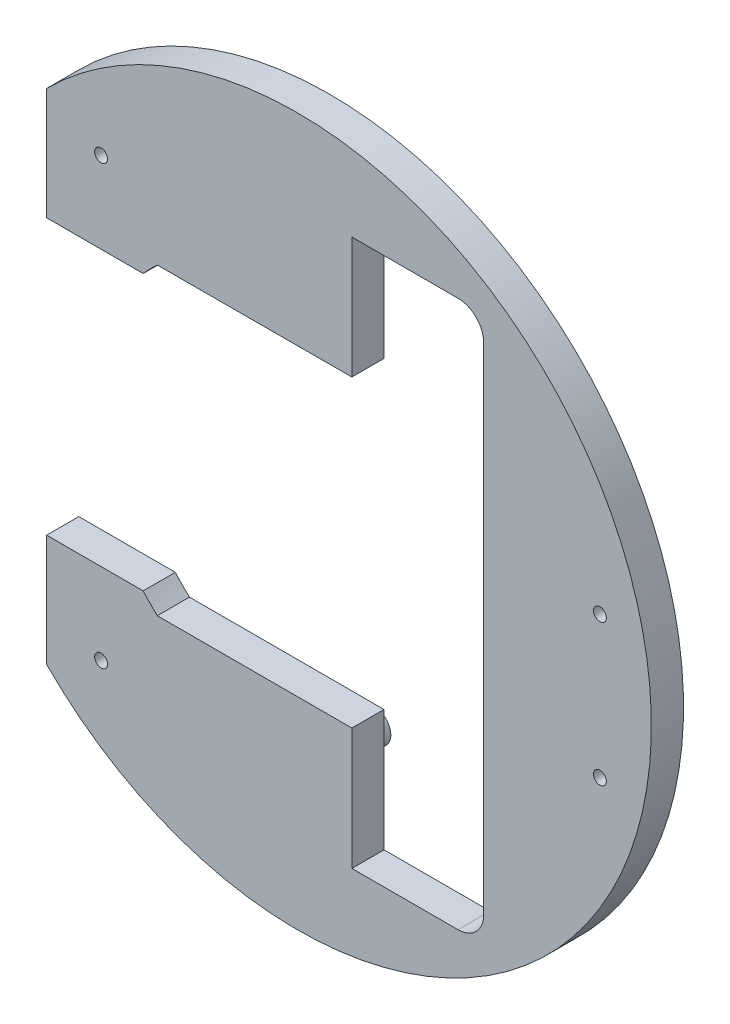
ISO-10303-21;
HEADER;
FILE_DESCRIPTION(('STEP AP214'),'2;1');
FILE_NAME('part.step','',(''),(''),'','','');
FILE_SCHEMA(('AUTOMOTIVE_DESIGN { 1 0 10303 214 1 1 1 1 }'));
ENDSEC;
DATA;
#1=APPLICATION_CONTEXT('core data for automotive mechanical design processes');
#2=APPLICATION_PROTOCOL_DEFINITION('international standard','automotive_design',2000,#1);
#3=PRODUCT_CONTEXT('',#1,'mechanical');
#4=PRODUCT('Part','Part','',(#3));
#5=PRODUCT_RELATED_PRODUCT_CATEGORY('part','',(#4));
#6=PRODUCT_DEFINITION_FORMATION('','',#4);
#7=PRODUCT_DEFINITION_CONTEXT('part definition',#1,'design');
#8=PRODUCT_DEFINITION('design','',#6,#7);
#9=PRODUCT_DEFINITION_SHAPE('','',#8);
#10=(LENGTH_UNIT() NAMED_UNIT(*) SI_UNIT(.MILLI.,.METRE.));
#11=(NAMED_UNIT(*) PLANE_ANGLE_UNIT() SI_UNIT($,.RADIAN.));
#12=(NAMED_UNIT(*) SI_UNIT($,.STERADIAN.) SOLID_ANGLE_UNIT());
#13=UNCERTAINTY_MEASURE_WITH_UNIT(LENGTH_MEASURE(1.E-05),#10,'distance_accuracy_value','');
#14=(GEOMETRIC_REPRESENTATION_CONTEXT(3) GLOBAL_UNCERTAINTY_ASSIGNED_CONTEXT((#13)) GLOBAL_UNIT_ASSIGNED_CONTEXT((#10,
#11,#12)) REPRESENTATION_CONTEXT('',''));
#15=CARTESIAN_POINT('',(0.,0.,0.));
#16=DIRECTION('',(0.,0.,1.));
#17=DIRECTION('',(1.,0.,0.));
#18=AXIS2_PLACEMENT_3D('',#15,#16,#17);
#19=CARTESIAN_POINT('',(-13.047599403235,-23.6022405207636,5.));
#20=DIRECTION('',(0.,-1.,0.));
#21=DIRECTION('',(1.,0.,0.));
#22=AXIS2_PLACEMENT_3D('',#19,#20,#21);
#23=PLANE('',#22);
#24=DIRECTION('',(-1.,0.,0.));
#25=VECTOR('',#24,1.);
#26=CARTESIAN_POINT('',(-13.047599403235,-23.6022405207636,0.));
#27=LINE('',#26,#25);
#28=CARTESIAN_POINT('',(8.4442741610997,-23.6022405207636,0.));
#29=VERTEX_POINT('',#28);
#30=CARTESIAN_POINT('',(-21.7987211184516,-23.6022405207636,0.));
#31=VERTEX_POINT('',#30);
#32=EDGE_CURVE('E109',#29,#31,#27,.T.);
#33=ORIENTED_EDGE('',*,*,#32,.T.);
#34=DIRECTION('',(0.,0.,-1.));
#35=VECTOR('',#34,1.);
#36=CARTESIAN_POINT('',(-21.7987211184516,-23.6022405207636,5.));
#37=LINE('',#36,#35);
#38=CARTESIAN_POINT('',(-21.7987211184516,-23.6022405207636,5.));
#39=VERTEX_POINT('',#38);
#40=EDGE_CURVE('E244',#39,#31,#37,.T.);
#41=ORIENTED_EDGE('',*,*,#40,.F.);
#42=DIRECTION('',(-1.,0.,0.));
#43=VECTOR('',#42,1.);
#44=CARTESIAN_POINT('',(8.4442741610997,-23.6022405207636,5.));
#45=LINE('',#44,#43);
#46=CARTESIAN_POINT('',(8.4442741610997,-23.6022405207636,5.));
#47=VERTEX_POINT('',#46);
#48=EDGE_CURVE('E115',#47,#39,#45,.T.);
#49=ORIENTED_EDGE('',*,*,#48,.F.);
#50=DIRECTION('',(0.,0.,-1.));
#51=VECTOR('',#50,1.);
#52=CARTESIAN_POINT('',(8.4442741610997,-23.6022405207636,5.));
#53=LINE('',#52,#51);
#54=EDGE_CURVE('E173',#47,#29,#53,.T.);
#55=ORIENTED_EDGE('',*,*,#54,.T.);
#56=EDGE_LOOP('',(#33,#41,#49,#55));
#57=FACE_BOUND('',#56,.T.);
#58=ADVANCED_FACE('F33',(#57),#23,.F.);
#59=CARTESIAN_POINT('',(0.,0.,5.));
#60=DIRECTION('',(0.,0.,-1.));
#61=DIRECTION('',(-1.,0.,0.));
#62=AXIS2_PLACEMENT_3D('',#59,#60,#61);
#63=CYLINDRICAL_SURFACE('',#62,32.1286476528347);
#64=CARTESIAN_POINT('',(0.,0.,0.));
#65=DIRECTION('',(0.,0.,-1.));
#66=DIRECTION('',(1.,0.,0.));
#67=AXIS2_PLACEMENT_3D('',#64,#65,#66);
#68=CIRCLE('',#67,32.1286476528347);
#69=CARTESIAN_POINT('',(-24.,-21.3600093632938,0.));
#70=VERTEX_POINT('',#69);
#71=EDGE_CURVE('E178',#31,#70,#68,.T.);
#72=ORIENTED_EDGE('',*,*,#71,.T.);
#73=DIRECTION('',(0.,0.,-1.));
#74=VECTOR('',#73,1.);
#75=CARTESIAN_POINT('',(-24.,-21.3600093632938,5.));
#76=LINE('',#75,#74);
#77=CARTESIAN_POINT('',(-24.,-21.3600093632938,5.));
#78=VERTEX_POINT('',#77);
#79=EDGE_CURVE('E241',#78,#70,#76,.T.);
#80=ORIENTED_EDGE('',*,*,#79,.F.);
#81=CARTESIAN_POINT('',(0.,0.,5.));
#82=DIRECTION('',(0.,0.,-1.));
#83=DIRECTION('',(1.,0.,0.));
#84=AXIS2_PLACEMENT_3D('',#81,#82,#83);
#85=CIRCLE('',#84,32.1286476528347);
#86=EDGE_CURVE('E278',#39,#78,#85,.T.);
#87=ORIENTED_EDGE('',*,*,#86,.F.);
#88=ORIENTED_EDGE('',*,*,#40,.T.);
#89=EDGE_LOOP('',(#72,#80,#87,#88));
#90=FACE_BOUND('',#89,.T.);
#91=ADVANCED_FACE('F269',(#90),#63,.F.);
#92=CARTESIAN_POINT('',(-24.,-21.3600093632938,5.));
#93=DIRECTION('',(0.,-1.,0.));
#94=DIRECTION('',(1.,0.,0.));
#95=AXIS2_PLACEMENT_3D('',#92,#93,#94);
#96=PLANE('',#95);
#97=DIRECTION('',(-1.,0.,0.));
#98=VECTOR('',#97,1.);
#99=CARTESIAN_POINT('',(-24.,-21.3600093632938,0.));
#100=LINE('',#99,#98);
#101=CARTESIAN_POINT('',(-39.,-21.3600093632938,0.));
#102=VERTEX_POINT('',#101);
#103=EDGE_CURVE('E181',#70,#102,#100,.T.);
#104=ORIENTED_EDGE('',*,*,#103,.T.);
#105=DIRECTION('',(0.,0.,-1.));
#106=VECTOR('',#105,1.);
#107=CARTESIAN_POINT('',(-39.,-21.3600093632938,5.));
#108=LINE('',#107,#106);
#109=CARTESIAN_POINT('',(-39.,-21.3600093632938,5.));
#110=VERTEX_POINT('',#109);
#111=EDGE_CURVE('E238',#110,#102,#108,.T.);
#112=ORIENTED_EDGE('',*,*,#111,.F.);
#113=DIRECTION('',(-1.,0.,0.));
#114=VECTOR('',#113,1.);
#115=CARTESIAN_POINT('',(-24.,-21.3600093632938,5.));
#116=LINE('',#115,#114);
#117=EDGE_CURVE('E292',#78,#110,#116,.T.);
#118=ORIENTED_EDGE('',*,*,#117,.F.);
#119=ORIENTED_EDGE('',*,*,#79,.T.);
#120=EDGE_LOOP('',(#104,#112,#118,#119));
#121=FACE_BOUND('',#120,.T.);
#122=ADVANCED_FACE('F274',(#121),#96,.F.);
#123=CARTESIAN_POINT('',(-39.,-21.3600093632938,5.));
#124=DIRECTION('',(1.,0.,0.));
#125=DIRECTION('',(0.,1.,0.));
#126=AXIS2_PLACEMENT_3D('',#123,#124,#125);
#127=PLANE('',#126);
#128=DIRECTION('',(0.,-1.,0.));
#129=VECTOR('',#128,1.);
#130=CARTESIAN_POINT('',(-39.,-21.3600093632938,0.));
#131=LINE('',#130,#129);
#132=CARTESIAN_POINT('',(-39.,-38.7814388593306,0.));
#133=VERTEX_POINT('',#132);
#134=EDGE_CURVE('E183',#102,#133,#131,.T.);
#135=ORIENTED_EDGE('',*,*,#134,.T.);
#136=DIRECTION('',(0.,0.,-1.));
#137=VECTOR('',#136,1.);
#138=CARTESIAN_POINT('',(-39.,-38.7814388593306,5.));
#139=LINE('',#138,#137);
#140=CARTESIAN_POINT('',(-39.,-38.7814388593306,5.));
#141=VERTEX_POINT('',#140);
#142=EDGE_CURVE('E235',#141,#133,#139,.T.);
#143=ORIENTED_EDGE('',*,*,#142,.F.);
#144=DIRECTION('',(0.,-1.,0.));
#145=VECTOR('',#144,1.);
#146=CARTESIAN_POINT('',(-39.,-21.3600093632938,5.));
#147=LINE('',#146,#145);
#148=EDGE_CURVE('E289',#110,#141,#147,.T.);
#149=ORIENTED_EDGE('',*,*,#148,.F.);
#150=ORIENTED_EDGE('',*,*,#111,.T.);
#151=EDGE_LOOP('',(#135,#143,#149,#150));
#152=FACE_BOUND('',#151,.T.);
#153=ADVANCED_FACE('F287',(#152),#127,.F.);
#154=CARTESIAN_POINT('',(0.,0.,5.));
#155=DIRECTION('',(0.,0.,-1.));
#156=DIRECTION('',(-1.,0.,0.));
#157=AXIS2_PLACEMENT_3D('',#154,#155,#156);
#158=CYLINDRICAL_SURFACE('',#157,55.);
#159=CARTESIAN_POINT('',(0.,0.,0.));
#160=DIRECTION('',(0.,0.,1.));
#161=DIRECTION('',(1.,0.,0.));
#162=AXIS2_PLACEMENT_3D('',#159,#160,#161);
#163=CIRCLE('',#162,55.);
#164=CARTESIAN_POINT('',(-39.,38.7814388593306,0.));
#165=VERTEX_POINT('',#164);
#166=EDGE_CURVE('E185',#133,#165,#163,.T.);
#167=ORIENTED_EDGE('',*,*,#166,.T.);
#168=DIRECTION('',(0.,0.,-1.));
#169=VECTOR('',#168,1.);
#170=CARTESIAN_POINT('',(-39.,38.7814388593306,5.));
#171=LINE('',#170,#169);
#172=CARTESIAN_POINT('',(-39.,38.7814388593306,5.));
#173=VERTEX_POINT('',#172);
#174=EDGE_CURVE('E232',#173,#165,#171,.T.);
#175=ORIENTED_EDGE('',*,*,#174,.F.);
#176=CARTESIAN_POINT('',(0.,0.,5.));
#177=DIRECTION('',(0.,0.,1.));
#178=DIRECTION('',(1.,0.,0.));
#179=AXIS2_PLACEMENT_3D('',#176,#177,#178);
#180=CIRCLE('',#179,55.);
#181=EDGE_CURVE('E291',#141,#173,#180,.T.);
#182=ORIENTED_EDGE('',*,*,#181,.F.);
#183=ORIENTED_EDGE('',*,*,#142,.T.);
#184=EDGE_LOOP('',(#167,#175,#182,#183));
#185=FACE_BOUND('',#184,.T.);
#186=ADVANCED_FACE('F552',(#185),#158,.T.);
#187=CARTESIAN_POINT('',(-39.,38.7814388593306,5.));
#188=DIRECTION('',(1.,0.,0.));
#189=DIRECTION('',(0.,1.,0.));
#190=AXIS2_PLACEMENT_3D('',#187,#188,#189);
#191=PLANE('',#190);
#192=DIRECTION('',(0.,-1.,0.));
#193=VECTOR('',#192,1.);
#194=CARTESIAN_POINT('',(-39.,38.7814388593306,0.));
#195=LINE('',#194,#193);
#196=CARTESIAN_POINT('',(-39.,21.3600093632938,0.));
#197=VERTEX_POINT('',#196);
#198=EDGE_CURVE('E187',#165,#197,#195,.T.);
#199=ORIENTED_EDGE('',*,*,#198,.T.);
#200=DIRECTION('',(0.,0.,-1.));
#201=VECTOR('',#200,1.);
#202=CARTESIAN_POINT('',(-39.,21.3600093632938,5.));
#203=LINE('',#202,#201);
#204=CARTESIAN_POINT('',(-39.,21.3600093632938,5.));
#205=VERTEX_POINT('',#204);
#206=EDGE_CURVE('E229',#205,#197,#203,.T.);
#207=ORIENTED_EDGE('',*,*,#206,.F.);
#208=DIRECTION('',(0.,-1.,0.));
#209=VECTOR('',#208,1.);
#210=CARTESIAN_POINT('',(-39.,38.7814388593306,5.));
#211=LINE('',#210,#209);
#212=EDGE_CURVE('E294',#173,#205,#211,.T.);
#213=ORIENTED_EDGE('',*,*,#212,.F.);
#214=ORIENTED_EDGE('',*,*,#174,.T.);
#215=EDGE_LOOP('',(#199,#207,#213,#214));
#216=FACE_BOUND('',#215,.T.);
#217=ADVANCED_FACE('F542',(#216),#191,.F.);
#218=CARTESIAN_POINT('',(-39.,21.3600093632938,5.));
#219=DIRECTION('',(0.,1.,0.));
#220=DIRECTION('',(-1.,0.,0.));
#221=AXIS2_PLACEMENT_3D('',#218,#219,#220);
#222=PLANE('',#221);
#223=DIRECTION('',(1.,0.,0.));
#224=VECTOR('',#223,1.);
#225=CARTESIAN_POINT('',(-39.,21.3600093632938,0.));
#226=LINE('',#225,#224);
#227=CARTESIAN_POINT('',(-24.,21.3600093632938,0.));
#228=VERTEX_POINT('',#227);
#229=EDGE_CURVE('E189',#197,#228,#226,.T.);
#230=ORIENTED_EDGE('',*,*,#229,.T.);
#231=DIRECTION('',(0.,0.,-1.));
#232=VECTOR('',#231,1.);
#233=CARTESIAN_POINT('',(-24.,21.3600093632938,5.));
#234=LINE('',#233,#232);
#235=CARTESIAN_POINT('',(-24.,21.3600093632938,5.));
#236=VERTEX_POINT('',#235);
#237=EDGE_CURVE('E226',#236,#228,#234,.T.);
#238=ORIENTED_EDGE('',*,*,#237,.F.);
#239=DIRECTION('',(1.,0.,0.));
#240=VECTOR('',#239,1.);
#241=CARTESIAN_POINT('',(-39.,21.3600093632938,5.));
#242=LINE('',#241,#240);
#243=EDGE_CURVE('E300',#205,#236,#242,.T.);
#244=ORIENTED_EDGE('',*,*,#243,.F.);
#245=ORIENTED_EDGE('',*,*,#206,.T.);
#246=EDGE_LOOP('',(#230,#238,#244,#245));
#247=FACE_BOUND('',#246,.T.);
#248=ADVANCED_FACE('F532',(#247),#222,.F.);
#249=CARTESIAN_POINT('',(0.,0.,5.));
#250=DIRECTION('',(0.,0.,-1.));
#251=DIRECTION('',(-1.,0.,0.));
#252=AXIS2_PLACEMENT_3D('',#249,#250,#251);
#253=CYLINDRICAL_SURFACE('',#252,32.1286476528347);
#254=CARTESIAN_POINT('',(0.,0.,0.));
#255=DIRECTION('',(0.,0.,-1.));
#256=DIRECTION('',(1.,0.,0.));
#257=AXIS2_PLACEMENT_3D('',#254,#255,#256);
#258=CIRCLE('',#257,32.1286476528347);
#259=CARTESIAN_POINT('',(-21.7987211184532,23.6022405207621,0.));
#260=VERTEX_POINT('',#259);
#261=EDGE_CURVE('E191',#228,#260,#258,.T.);
#262=ORIENTED_EDGE('',*,*,#261,.T.);
#263=DIRECTION('',(0.,0.,-1.));
#264=VECTOR('',#263,1.);
#265=CARTESIAN_POINT('',(-21.7987211184532,23.6022405207621,5.));
#266=LINE('',#265,#264);
#267=CARTESIAN_POINT('',(-21.7987211184532,23.6022405207621,5.));
#268=VERTEX_POINT('',#267);
#269=EDGE_CURVE('E223',#268,#260,#266,.T.);
#270=ORIENTED_EDGE('',*,*,#269,.F.);
#271=CARTESIAN_POINT('',(0.,0.,5.));
#272=DIRECTION('',(0.,0.,-1.));
#273=DIRECTION('',(1.,0.,0.));
#274=AXIS2_PLACEMENT_3D('',#271,#272,#273);
#275=CIRCLE('',#274,32.1286476528347);
#276=EDGE_CURVE('E302',#236,#268,#275,.T.);
#277=ORIENTED_EDGE('',*,*,#276,.F.);
#278=ORIENTED_EDGE('',*,*,#237,.T.);
#279=EDGE_LOOP('',(#262,#270,#277,#278));
#280=FACE_BOUND('',#279,.T.);
#281=ADVANCED_FACE('F522',(#280),#253,.F.);
#282=CARTESIAN_POINT('',(-21.7987211184532,23.6022405207621,5.));
#283=DIRECTION('',(-0.00169296763792218,0.999998566929262,0.));
#284=DIRECTION('',(-0.999998566929262,-0.00169296763792218,0.));
#285=AXIS2_PLACEMENT_3D('',#282,#283,#284);
#286=PLANE('',#285);
#287=DIRECTION('',(0.999998566929262,0.00169296763792218,0.));
#288=VECTOR('',#287,1.);
#289=CARTESIAN_POINT('',(-21.7987211184532,23.6022405207621,0.));
#290=LINE('',#289,#288);
#291=CARTESIAN_POINT('',(8.4442741610997,23.6534410064181,0.));
#292=VERTEX_POINT('',#291);
#293=EDGE_CURVE('E193',#260,#292,#290,.T.);
#294=ORIENTED_EDGE('',*,*,#293,.T.);
#295=DIRECTION('',(0.,0.,-1.));
#296=VECTOR('',#295,1.);
#297=CARTESIAN_POINT('',(8.4442741610997,23.6534410064181,5.));
#298=LINE('',#297,#296);
#299=CARTESIAN_POINT('',(8.4442741610997,23.6534410064181,5.));
#300=VERTEX_POINT('',#299);
#301=EDGE_CURVE('E220',#300,#292,#298,.T.);
#302=ORIENTED_EDGE('',*,*,#301,.F.);
#303=DIRECTION('',(0.999998566929262,0.00169296763792218,0.));
#304=VECTOR('',#303,1.);
#305=CARTESIAN_POINT('',(-21.7987211184532,23.6022405207621,5.));
#306=LINE('',#305,#304);
#307=EDGE_CURVE('E304',#268,#300,#306,.T.);
#308=ORIENTED_EDGE('',*,*,#307,.F.);
#309=ORIENTED_EDGE('',*,*,#269,.T.);
#310=EDGE_LOOP('',(#294,#302,#308,#309));
#311=FACE_BOUND('',#310,.T.);
#312=ADVANCED_FACE('F512',(#311),#286,.F.);
#313=CARTESIAN_POINT('',(8.4442741610997,23.6534410064181,5.));
#314=DIRECTION('',(-1.,0.,0.));
#315=DIRECTION('',(0.,-1.,0.));
#316=AXIS2_PLACEMENT_3D('',#313,#314,#315);
#317=PLANE('',#316);
#318=DIRECTION('',(0.,1.,0.));
#319=VECTOR('',#318,1.);
#320=CARTESIAN_POINT('',(8.4442741610997,23.6534410064181,0.));
#321=LINE('',#320,#319);
#322=CARTESIAN_POINT('',(8.44427416109974,42.5,0.));
#323=VERTEX_POINT('',#322);
#324=EDGE_CURVE('E195',#292,#323,#321,.T.);
#325=ORIENTED_EDGE('',*,*,#324,.T.);
#326=DIRECTION('',(0.,0.,-1.));
#327=VECTOR('',#326,1.);
#328=CARTESIAN_POINT('',(8.44427416109974,42.5,5.));
#329=LINE('',#328,#327);
#330=CARTESIAN_POINT('',(8.44427416109974,42.5,5.));
#331=VERTEX_POINT('',#330);
#332=EDGE_CURVE('E217',#331,#323,#329,.T.);
#333=ORIENTED_EDGE('',*,*,#332,.F.);
#334=DIRECTION('',(0.,1.,0.));
#335=VECTOR('',#334,1.);
#336=CARTESIAN_POINT('',(8.4442741610997,23.6534410064181,5.));
#337=LINE('',#336,#335);
#338=EDGE_CURVE('E306',#300,#331,#337,.T.);
#339=ORIENTED_EDGE('',*,*,#338,.F.);
#340=ORIENTED_EDGE('',*,*,#301,.T.);
#341=EDGE_LOOP('',(#325,#333,#339,#340));
#342=FACE_BOUND('',#341,.T.);
#343=ADVANCED_FACE('F502',(#342),#317,.F.);
#344=CARTESIAN_POINT('',(8.44427416109974,42.5,5.));
#345=DIRECTION('',(0.,1.,0.));
#346=DIRECTION('',(0.,0.,1.));
#347=AXIS2_PLACEMENT_3D('',#344,#345,#346);
#348=PLANE('',#347);
#349=DIRECTION('',(1.,0.,0.));
#350=VECTOR('',#349,1.);
#351=CARTESIAN_POINT('',(8.44427416109974,42.5,0.));
#352=LINE('',#351,#350);
#353=CARTESIAN_POINT('',(24.9440182402168,42.5,0.));
#354=VERTEX_POINT('',#353);
#355=EDGE_CURVE('E197',#323,#354,#352,.T.);
#356=ORIENTED_EDGE('',*,*,#355,.T.);
#357=DIRECTION('',(0.,0.,-1.));
#358=VECTOR('',#357,1.);
#359=CARTESIAN_POINT('',(24.9440182402168,42.5,5.));
#360=LINE('',#359,#358);
#361=CARTESIAN_POINT('',(24.9440182402168,42.5,5.));
#362=VERTEX_POINT('',#361);
#363=EDGE_CURVE('E214',#362,#354,#360,.T.);
#364=ORIENTED_EDGE('',*,*,#363,.F.);
#365=DIRECTION('',(1.,0.,0.));
#366=VECTOR('',#365,1.);
#367=CARTESIAN_POINT('',(8.44427416109974,42.5,5.));
#368=LINE('',#367,#366);
#369=EDGE_CURVE('E308',#331,#362,#368,.T.);
#370=ORIENTED_EDGE('',*,*,#369,.F.);
#371=ORIENTED_EDGE('',*,*,#332,.T.);
#372=EDGE_LOOP('',(#356,#364,#370,#371));
#373=FACE_BOUND('',#372,.T.);
#374=ADVANCED_FACE('F493',(#373),#348,.F.);
#375=CARTESIAN_POINT('',(24.9440182402168,38.5,5.));
#376=DIRECTION('',(0.,0.,-1.));
#377=DIRECTION('',(-1.,0.,0.));
#378=AXIS2_PLACEMENT_3D('',#375,#376,#377);
#379=CYLINDRICAL_SURFACE('',#378,4.);
#380=CARTESIAN_POINT('',(24.9440182402168,38.5,0.));
#381=DIRECTION('',(0.,0.,-1.));
#382=DIRECTION('',(1.,0.,0.));
#383=AXIS2_PLACEMENT_3D('',#380,#381,#382);
#384=CIRCLE('',#383,4.);
#385=CARTESIAN_POINT('',(28.9440182402168,38.5,0.));
#386=VERTEX_POINT('',#385);
#387=EDGE_CURVE('E199',#354,#386,#384,.T.);
#388=ORIENTED_EDGE('',*,*,#387,.T.);
#389=DIRECTION('',(0.,0.,-1.));
#390=VECTOR('',#389,1.);
#391=CARTESIAN_POINT('',(28.9440182402168,38.5,5.));
#392=LINE('',#391,#390);
#393=CARTESIAN_POINT('',(28.9440182402168,38.5,5.));
#394=VERTEX_POINT('',#393);
#395=EDGE_CURVE('E211',#394,#386,#392,.T.);
#396=ORIENTED_EDGE('',*,*,#395,.F.);
#397=CARTESIAN_POINT('',(24.9440182402168,38.5,5.));
#398=DIRECTION('',(0.,0.,-1.));
#399=DIRECTION('',(1.,0.,0.));
#400=AXIS2_PLACEMENT_3D('',#397,#398,#399);
#401=CIRCLE('',#400,4.);
#402=EDGE_CURVE('E310',#362,#394,#401,.T.);
#403=ORIENTED_EDGE('',*,*,#402,.F.);
#404=ORIENTED_EDGE('',*,*,#363,.T.);
#405=EDGE_LOOP('',(#388,#396,#403,#404));
#406=FACE_BOUND('',#405,.T.);
#407=ADVANCED_FACE('F316',(#406),#379,.F.);
#408=CARTESIAN_POINT('',(28.9440182402168,38.5,5.));
#409=DIRECTION('',(1.,0.,0.));
#410=DIRECTION('',(0.,0.,-1.));
#411=AXIS2_PLACEMENT_3D('',#408,#409,#410);
#412=PLANE('',#411);
#413=DIRECTION('',(0.,-1.,0.));
#414=VECTOR('',#413,1.);
#415=CARTESIAN_POINT('',(28.9440182402168,38.5,0.));
#416=LINE('',#415,#414);
#417=CARTESIAN_POINT('',(28.9440182402168,-38.5,0.));
#418=VERTEX_POINT('',#417);
#419=EDGE_CURVE('E201',#386,#418,#416,.T.);
#420=ORIENTED_EDGE('',*,*,#419,.T.);
#421=DIRECTION('',(0.,0.,-1.));
#422=VECTOR('',#421,1.);
#423=CARTESIAN_POINT('',(28.9440182402168,-38.5,5.));
#424=LINE('',#423,#422);
#425=CARTESIAN_POINT('',(28.9440182402168,-38.5,5.));
#426=VERTEX_POINT('',#425);
#427=EDGE_CURVE('E168',#426,#418,#424,.T.);
#428=ORIENTED_EDGE('',*,*,#427,.F.);
#429=DIRECTION('',(0.,-1.,0.));
#430=VECTOR('',#429,1.);
#431=CARTESIAN_POINT('',(28.9440182402168,38.5,5.));
#432=LINE('',#431,#430);
#433=EDGE_CURVE('E159',#394,#426,#432,.T.);
#434=ORIENTED_EDGE('',*,*,#433,.F.);
#435=ORIENTED_EDGE('',*,*,#395,.T.);
#436=EDGE_LOOP('',(#420,#428,#434,#435));
#437=FACE_BOUND('',#436,.T.);
#438=ADVANCED_FACE('F320',(#437),#412,.F.);
#439=CARTESIAN_POINT('',(24.9440182402168,-38.5,5.));
#440=DIRECTION('',(0.,0.,-1.));
#441=DIRECTION('',(-1.,0.,0.));
#442=AXIS2_PLACEMENT_3D('',#439,#440,#441);
#443=CYLINDRICAL_SURFACE('',#442,4.);
#444=CARTESIAN_POINT('',(24.9440182402168,-38.5,0.));
#445=DIRECTION('',(0.,0.,-1.));
#446=DIRECTION('',(1.,0.,0.));
#447=AXIS2_PLACEMENT_3D('',#444,#445,#446);
#448=CIRCLE('',#447,4.);
#449=CARTESIAN_POINT('',(24.9440182402168,-42.5,0.));
#450=VERTEX_POINT('',#449);
#451=EDGE_CURVE('E167',#418,#450,#448,.T.);
#452=ORIENTED_EDGE('',*,*,#451,.T.);
#453=DIRECTION('',(0.,0.,-1.));
#454=VECTOR('',#453,1.);
#455=CARTESIAN_POINT('',(24.9440182402168,-42.5,5.));
#456=LINE('',#455,#454);
#457=CARTESIAN_POINT('',(24.9440182402168,-42.5,5.));
#458=VERTEX_POINT('',#457);
#459=EDGE_CURVE('E164',#458,#450,#456,.T.);
#460=ORIENTED_EDGE('',*,*,#459,.F.);
#461=CARTESIAN_POINT('',(24.9440182402168,-38.5,5.));
#462=DIRECTION('',(0.,0.,-1.));
#463=DIRECTION('',(1.,0.,0.));
#464=AXIS2_PLACEMENT_3D('',#461,#462,#463);
#465=CIRCLE('',#464,4.);
#466=EDGE_CURVE('E153',#426,#458,#465,.T.);
#467=ORIENTED_EDGE('',*,*,#466,.F.);
#468=ORIENTED_EDGE('',*,*,#427,.T.);
#469=EDGE_LOOP('',(#452,#460,#467,#468));
#470=FACE_BOUND('',#469,.T.);
#471=ADVANCED_FACE('F165',(#470),#443,.F.);
#472=CARTESIAN_POINT('',(24.9440182402168,-42.5,5.));
#473=DIRECTION('',(0.,-1.,0.));
#474=DIRECTION('',(0.,0.,-1.));
#475=AXIS2_PLACEMENT_3D('',#472,#473,#474);
#476=PLANE('',#475);
#477=DIRECTION('',(-1.,0.,0.));
#478=VECTOR('',#477,1.);
#479=CARTESIAN_POINT('',(24.9440182402168,-42.5,0.));
#480=LINE('',#479,#478);
#481=CARTESIAN_POINT('',(8.4442741610997,-42.5,0.));
#482=VERTEX_POINT('',#481);
#483=EDGE_CURVE('E102',#450,#482,#480,.T.);
#484=ORIENTED_EDGE('',*,*,#483,.T.);
#485=DIRECTION('',(0.,0.,-1.));
#486=VECTOR('',#485,1.);
#487=CARTESIAN_POINT('',(8.4442741610997,-42.5,5.));
#488=LINE('',#487,#486);
#489=CARTESIAN_POINT('',(8.4442741610997,-42.5,5.));
#490=VERTEX_POINT('',#489);
#491=EDGE_CURVE('E169',#490,#482,#488,.T.);
#492=ORIENTED_EDGE('',*,*,#491,.F.);
#493=DIRECTION('',(-1.,0.,0.));
#494=VECTOR('',#493,1.);
#495=CARTESIAN_POINT('',(24.9440182402168,-42.5,5.));
#496=LINE('',#495,#494);
#497=EDGE_CURVE('E157',#458,#490,#496,.T.);
#498=ORIENTED_EDGE('',*,*,#497,.F.);
#499=ORIENTED_EDGE('',*,*,#459,.T.);
#500=EDGE_LOOP('',(#484,#492,#498,#499));
#501=FACE_BOUND('',#500,.T.);
#502=ADVANCED_FACE('F171',(#501),#476,.F.);
#503=CARTESIAN_POINT('',(8.4442741610997,-42.5,5.));
#504=DIRECTION('',(-1.,0.,0.));
#505=DIRECTION('',(0.,0.,1.));
#506=AXIS2_PLACEMENT_3D('',#503,#504,#505);
#507=PLANE('',#506);
#508=DIRECTION('',(0.,1.,0.));
#509=VECTOR('',#508,1.);
#510=CARTESIAN_POINT('',(8.4442741610997,-42.5,0.));
#511=LINE('',#510,#509);
#512=EDGE_CURVE('E205',#482,#29,#511,.T.);
#513=ORIENTED_EDGE('',*,*,#512,.T.);
#514=ORIENTED_EDGE('',*,*,#54,.F.);
#515=DIRECTION('',(0.,1.,0.));
#516=VECTOR('',#515,1.);
#517=CARTESIAN_POINT('',(8.4442741610997,-42.5,5.));
#518=LINE('',#517,#516);
#519=EDGE_CURVE('E49',#490,#47,#518,.T.);
#520=ORIENTED_EDGE('',*,*,#519,.F.);
#521=ORIENTED_EDGE('',*,*,#491,.T.);
#522=EDGE_LOOP('',(#513,#514,#520,#521));
#523=FACE_BOUND('',#522,.T.);
#524=ADVANCED_FACE('F262',(#523),#507,.F.);
#525=CARTESIAN_POINT('',(0.,0.,5.));
#526=DIRECTION('',(0.,0.,1.));
#527=DIRECTION('',(1.,0.,0.));
#528=AXIS2_PLACEMENT_3D('',#525,#526,#527);
#529=PLANE('',#528);
#530=CARTESIAN_POINT('',(-30.5378788909605,-34.,5.));
#531=DIRECTION('',(0.,0.,1.));
#532=DIRECTION('',(1.,0.,0.));
#533=AXIS2_PLACEMENT_3D('',#530,#531,#532);
#534=CIRCLE('',#533,1.);
#535=CARTESIAN_POINT('',(-29.5378788909605,-34.,5.));
#536=VERTEX_POINT('',#535);
#537=EDGE_CURVE('E346',#536,#536,#534,.T.);
#538=ORIENTED_EDGE('',*,*,#537,.F.);
#539=EDGE_LOOP('',(#538));
#540=FACE_BOUND('',#539,.T.);
#541=CARTESIAN_POINT('',(-30.5378788909605,34.,5.));
#542=DIRECTION('',(0.,0.,1.));
#543=DIRECTION('',(1.,0.,0.));
#544=AXIS2_PLACEMENT_3D('',#541,#542,#543);
#545=CIRCLE('',#544,1.);
#546=CARTESIAN_POINT('',(-29.5378788909605,34.,5.));
#547=VERTEX_POINT('',#546);
#548=EDGE_CURVE('E340',#547,#547,#545,.T.);
#549=ORIENTED_EDGE('',*,*,#548,.F.);
#550=EDGE_LOOP('',(#549));
#551=FACE_BOUND('',#550,.T.);
#552=CARTESIAN_POINT('',(47.,11.,5.));
#553=DIRECTION('',(0.,0.,1.));
#554=DIRECTION('',(1.,0.,0.));
#555=AXIS2_PLACEMENT_3D('',#552,#553,#554);
#556=CIRCLE('',#555,0.999999999999998);
#557=CARTESIAN_POINT('',(48.,11.,5.));
#558=VERTEX_POINT('',#557);
#559=EDGE_CURVE('E333',#558,#558,#556,.T.);
#560=ORIENTED_EDGE('',*,*,#559,.F.);
#561=EDGE_LOOP('',(#560));
#562=FACE_BOUND('',#561,.T.);
#563=CARTESIAN_POINT('',(47.,-11.,5.));
#564=DIRECTION('',(0.,0.,1.));
#565=DIRECTION('',(1.,0.,0.));
#566=AXIS2_PLACEMENT_3D('',#563,#564,#565);
#567=CIRCLE('',#566,0.999999999999998);
#568=CARTESIAN_POINT('',(48.,-11.,5.));
#569=VERTEX_POINT('',#568);
#570=EDGE_CURVE('E334',#569,#569,#567,.T.);
#571=ORIENTED_EDGE('',*,*,#570,.F.);
#572=EDGE_LOOP('',(#571));
#573=FACE_BOUND('',#572,.T.);
#574=ORIENTED_EDGE('',*,*,#48,.T.);
#575=ORIENTED_EDGE('',*,*,#86,.T.);
#576=ORIENTED_EDGE('',*,*,#117,.T.);
#577=ORIENTED_EDGE('',*,*,#148,.T.);
#578=ORIENTED_EDGE('',*,*,#181,.T.);
#579=ORIENTED_EDGE('',*,*,#212,.T.);
#580=ORIENTED_EDGE('',*,*,#243,.T.);
#581=ORIENTED_EDGE('',*,*,#276,.T.);
#582=ORIENTED_EDGE('',*,*,#307,.T.);
#583=ORIENTED_EDGE('',*,*,#338,.T.);
#584=ORIENTED_EDGE('',*,*,#369,.T.);
#585=ORIENTED_EDGE('',*,*,#402,.T.);
#586=ORIENTED_EDGE('',*,*,#433,.T.);
#587=ORIENTED_EDGE('',*,*,#466,.T.);
#588=ORIENTED_EDGE('',*,*,#497,.T.);
#589=ORIENTED_EDGE('',*,*,#519,.T.);
#590=EDGE_LOOP('',(#574,#575,#576,#577,#578,#579,#580,#581,#582,#583,#584,#585,#586,#587,#588,#589));
#591=FACE_BOUND('',#590,.T.);
#592=ADVANCED_FACE('F155',(#540,#551,#562,#573,#591),#529,.T.);
#593=CARTESIAN_POINT('',(0.,0.,0.));
#594=DIRECTION('',(0.,0.,1.));
#595=DIRECTION('',(1.,0.,0.));
#596=AXIS2_PLACEMENT_3D('',#593,#594,#595);
#597=PLANE('',#596);
#598=CARTESIAN_POINT('',(-30.5378788909605,-34.,0.));
#599=DIRECTION('',(0.,0.,1.));
#600=DIRECTION('',(1.,0.,0.));
#601=AXIS2_PLACEMENT_3D('',#598,#599,#600);
#602=CIRCLE('',#601,1.);
#603=CARTESIAN_POINT('',(-29.5378788909605,-34.,0.));
#604=VERTEX_POINT('',#603);
#605=EDGE_CURVE('E329',#604,#604,#602,.F.);
#606=ORIENTED_EDGE('',*,*,#605,.F.);
#607=EDGE_LOOP('',(#606));
#608=FACE_BOUND('',#607,.T.);
#609=CARTESIAN_POINT('',(-30.5378788909605,34.,0.));
#610=DIRECTION('',(0.,0.,1.));
#611=DIRECTION('',(1.,0.,0.));
#612=AXIS2_PLACEMENT_3D('',#609,#610,#611);
#613=CIRCLE('',#612,1.);
#614=CARTESIAN_POINT('',(-29.5378788909605,34.,0.));
#615=VERTEX_POINT('',#614);
#616=EDGE_CURVE('E343',#615,#615,#613,.F.);
#617=ORIENTED_EDGE('',*,*,#616,.F.);
#618=EDGE_LOOP('',(#617));
#619=FACE_BOUND('',#618,.T.);
#620=CARTESIAN_POINT('',(47.,11.,0.));
#621=DIRECTION('',(0.,0.,1.));
#622=DIRECTION('',(1.,0.,0.));
#623=AXIS2_PLACEMENT_3D('',#620,#621,#622);
#624=CIRCLE('',#623,0.999999999999998);
#625=CARTESIAN_POINT('',(48.,11.,0.));
#626=VERTEX_POINT('',#625);
#627=EDGE_CURVE('E337',#626,#626,#624,.F.);
#628=ORIENTED_EDGE('',*,*,#627,.F.);
#629=EDGE_LOOP('',(#628));
#630=FACE_BOUND('',#629,.T.);
#631=CARTESIAN_POINT('',(47.,-11.,0.));
#632=DIRECTION('',(0.,0.,1.));
#633=DIRECTION('',(1.,0.,0.));
#634=AXIS2_PLACEMENT_3D('',#631,#632,#633);
#635=CIRCLE('',#634,0.999999999999998);
#636=CARTESIAN_POINT('',(48.,-11.,0.));
#637=VERTEX_POINT('',#636);
#638=EDGE_CURVE('E330',#637,#637,#635,.F.);
#639=ORIENTED_EDGE('',*,*,#638,.F.);
#640=EDGE_LOOP('',(#639));
#641=FACE_BOUND('',#640,.T.);
#642=CARTESIAN_POINT('',(-7.61109925084824E-13,33.5000000000134,0.));
#643=DIRECTION('',(0.,0.,1.));
#644=DIRECTION('',(1.,0.,0.));
#645=AXIS2_PLACEMENT_3D('',#642,#643,#644);
#646=CIRCLE('',#645,2.5);
#647=CARTESIAN_POINT('',(2.49999999999924,33.5000000000134,0.));
#648=VERTEX_POINT('',#647);
#649=EDGE_CURVE('E11',#648,#648,#646,.F.);
#650=ORIENTED_EDGE('',*,*,#649,.F.);
#651=EDGE_LOOP('',(#650));
#652=FACE_BOUND('',#651,.T.);
#653=CARTESIAN_POINT('',(-7.39425881635114E-13,-33.4999999999866,0.));
#654=DIRECTION('',(0.,0.,1.));
#655=DIRECTION('',(1.,0.,0.));
#656=AXIS2_PLACEMENT_3D('',#653,#654,#655);
#657=CIRCLE('',#656,2.5);
#658=CARTESIAN_POINT('',(2.49999999999926,-33.4999999999866,0.));
#659=VERTEX_POINT('',#658);
#660=EDGE_CURVE('E41',#659,#659,#657,.F.);
#661=ORIENTED_EDGE('',*,*,#660,.F.);
#662=EDGE_LOOP('',(#661));
#663=FACE_BOUND('',#662,.T.);
#664=ORIENTED_EDGE('',*,*,#32,.F.);
#665=ORIENTED_EDGE('',*,*,#512,.F.);
#666=ORIENTED_EDGE('',*,*,#483,.F.);
#667=ORIENTED_EDGE('',*,*,#451,.F.);
#668=ORIENTED_EDGE('',*,*,#419,.F.);
#669=ORIENTED_EDGE('',*,*,#387,.F.);
#670=ORIENTED_EDGE('',*,*,#355,.F.);
#671=ORIENTED_EDGE('',*,*,#324,.F.);
#672=ORIENTED_EDGE('',*,*,#293,.F.);
#673=ORIENTED_EDGE('',*,*,#261,.F.);
#674=ORIENTED_EDGE('',*,*,#229,.F.);
#675=ORIENTED_EDGE('',*,*,#198,.F.);
#676=ORIENTED_EDGE('',*,*,#166,.F.);
#677=ORIENTED_EDGE('',*,*,#134,.F.);
#678=ORIENTED_EDGE('',*,*,#103,.F.);
#679=ORIENTED_EDGE('',*,*,#71,.F.);
#680=EDGE_LOOP('',(#664,#665,#666,#667,#668,#669,#670,#671,#672,#673,#674,#675,#676,#677,#678,#679));
#681=FACE_BOUND('',#680,.T.);
#682=ADVANCED_FACE('F251',(#608,#619,#630,#641,#652,#663,#681),#597,.F.);
#683=CARTESIAN_POINT('',(-7.39425881635114E-13,-33.4999999999866,-7.));
#684=DIRECTION('',(0.,0.,1.));
#685=DIRECTION('',(1.,0.,0.));
#686=AXIS2_PLACEMENT_3D('',#683,#684,#685);
#687=CYLINDRICAL_SURFACE('',#686,2.5);
#688=CARTESIAN_POINT('',(-7.39425881635114E-13,-33.4999999999866,-7.));
#689=DIRECTION('',(0.,0.,-1.));
#690=DIRECTION('',(-1.,0.,0.));
#691=AXIS2_PLACEMENT_3D('',#688,#689,#690);
#692=CIRCLE('',#691,2.5);
#693=CARTESIAN_POINT('',(-2.50000000000074,-33.4999999999866,-7.));
#694=VERTEX_POINT('',#693);
#695=EDGE_CURVE('E179',#694,#694,#692,.T.);
#696=ORIENTED_EDGE('',*,*,#695,.F.);
#697=EDGE_LOOP('',(#696));
#698=FACE_BOUND('',#697,.T.);
#699=ORIENTED_EDGE('',*,*,#660,.T.);
#700=EDGE_LOOP('',(#699));
#701=FACE_BOUND('',#700,.T.);
#702=ADVANCED_FACE('F249',(#698,#701),#687,.T.);
#703=CARTESIAN_POINT('',(-7.39425881635114E-13,-33.4999999999866,-7.));
#704=DIRECTION('',(0.,0.,-1.));
#705=DIRECTION('',(-1.,0.,0.));
#706=AXIS2_PLACEMENT_3D('',#703,#704,#705);
#707=PLANE('',#706);
#708=ORIENTED_EDGE('',*,*,#695,.T.);
#709=EDGE_LOOP('',(#708));
#710=FACE_BOUND('',#709,.T.);
#711=ADVANCED_FACE('F259',(#710),#707,.T.);
#712=CARTESIAN_POINT('',(-7.61109925084824E-13,33.5000000000134,-7.));
#713=DIRECTION('',(0.,0.,1.));
#714=DIRECTION('',(1.,0.,0.));
#715=AXIS2_PLACEMENT_3D('',#712,#713,#714);
#716=CYLINDRICAL_SURFACE('',#715,2.5);
#717=CARTESIAN_POINT('',(-7.61109925084824E-13,33.5000000000134,-7.));
#718=DIRECTION('',(0.,0.,-1.));
#719=DIRECTION('',(-1.,0.,0.));
#720=AXIS2_PLACEMENT_3D('',#717,#718,#719);
#721=CIRCLE('',#720,2.5);
#722=CARTESIAN_POINT('',(-2.50000000000076,33.5000000000134,-7.));
#723=VERTEX_POINT('',#722);
#724=EDGE_CURVE('E326',#723,#723,#721,.T.);
#725=ORIENTED_EDGE('',*,*,#724,.F.);
#726=EDGE_LOOP('',(#725));
#727=FACE_BOUND('',#726,.T.);
#728=ORIENTED_EDGE('',*,*,#649,.T.);
#729=EDGE_LOOP('',(#728));
#730=FACE_BOUND('',#729,.T.);
#731=ADVANCED_FACE('F375',(#727,#730),#716,.T.);
#732=CARTESIAN_POINT('',(-7.61109925084824E-13,33.5000000000134,-7.));
#733=DIRECTION('',(0.,0.,-1.));
#734=DIRECTION('',(-1.,0.,0.));
#735=AXIS2_PLACEMENT_3D('',#732,#733,#734);
#736=PLANE('',#735);
#737=ORIENTED_EDGE('',*,*,#724,.T.);
#738=EDGE_LOOP('',(#737));
#739=FACE_BOUND('',#738,.T.);
#740=ADVANCED_FACE('F365',(#739),#736,.T.);
#741=CARTESIAN_POINT('',(47.,-11.,-2.82842712474619));
#742=DIRECTION('',(0.,0.,1.));
#743=DIRECTION('',(1.,0.,0.));
#744=AXIS2_PLACEMENT_3D('',#741,#742,#743);
#745=CYLINDRICAL_SURFACE('',#744,0.999999999999998);
#746=ORIENTED_EDGE('',*,*,#638,.T.);
#747=EDGE_LOOP('',(#746));
#748=FACE_BOUND('',#747,.T.);
#749=ORIENTED_EDGE('',*,*,#570,.T.);
#750=EDGE_LOOP('',(#749));
#751=FACE_BOUND('',#750,.T.);
#752=ADVANCED_FACE('F362',(#748,#751),#745,.F.);
#753=CARTESIAN_POINT('',(47.,11.,-2.82842712474619));
#754=DIRECTION('',(0.,0.,1.));
#755=DIRECTION('',(1.,0.,0.));
#756=AXIS2_PLACEMENT_3D('',#753,#754,#755);
#757=CYLINDRICAL_SURFACE('',#756,0.999999999999998);
#758=ORIENTED_EDGE('',*,*,#627,.T.);
#759=EDGE_LOOP('',(#758));
#760=FACE_BOUND('',#759,.T.);
#761=ORIENTED_EDGE('',*,*,#559,.T.);
#762=EDGE_LOOP('',(#761));
#763=FACE_BOUND('',#762,.T.);
#764=ADVANCED_FACE('F364',(#760,#763),#757,.F.);
#765=CARTESIAN_POINT('',(-30.5378788909605,34.,-2.82842712474619));
#766=DIRECTION('',(0.,0.,1.));
#767=DIRECTION('',(1.,0.,0.));
#768=AXIS2_PLACEMENT_3D('',#765,#766,#767);
#769=CYLINDRICAL_SURFACE('',#768,1.);
#770=ORIENTED_EDGE('',*,*,#616,.T.);
#771=EDGE_LOOP('',(#770));
#772=FACE_BOUND('',#771,.T.);
#773=ORIENTED_EDGE('',*,*,#548,.T.);
#774=EDGE_LOOP('',(#773));
#775=FACE_BOUND('',#774,.T.);
#776=ADVANCED_FACE('F372',(#772,#775),#769,.F.);
#777=CARTESIAN_POINT('',(-30.5378788909605,-34.,-2.82842712474619));
#778=DIRECTION('',(0.,0.,1.));
#779=DIRECTION('',(1.,0.,0.));
#780=AXIS2_PLACEMENT_3D('',#777,#778,#779);
#781=CYLINDRICAL_SURFACE('',#780,1.);
#782=ORIENTED_EDGE('',*,*,#605,.T.);
#783=EDGE_LOOP('',(#782));
#784=FACE_BOUND('',#783,.T.);
#785=ORIENTED_EDGE('',*,*,#537,.T.);
#786=EDGE_LOOP('',(#785));
#787=FACE_BOUND('',#786,.T.);
#788=ADVANCED_FACE('F354',(#784,#787),#781,.F.);
#789=CLOSED_SHELL('',(#58,#91,#122,#153,#186,#217,#248,#281,#312,#343,#374,#407,#438,#471,#502,
#524,#592,#682,#702,#711,#731,#740,#752,#764,#776,#788));
#790=MANIFOLD_SOLID_BREP('B2',#789);
#791=ADVANCED_BREP_SHAPE_REPRESENTATION('',(#18,#790),#14);
#792=SHAPE_DEFINITION_REPRESENTATION(#9,#791);
ENDSEC;
END-ISO-10303-21;
